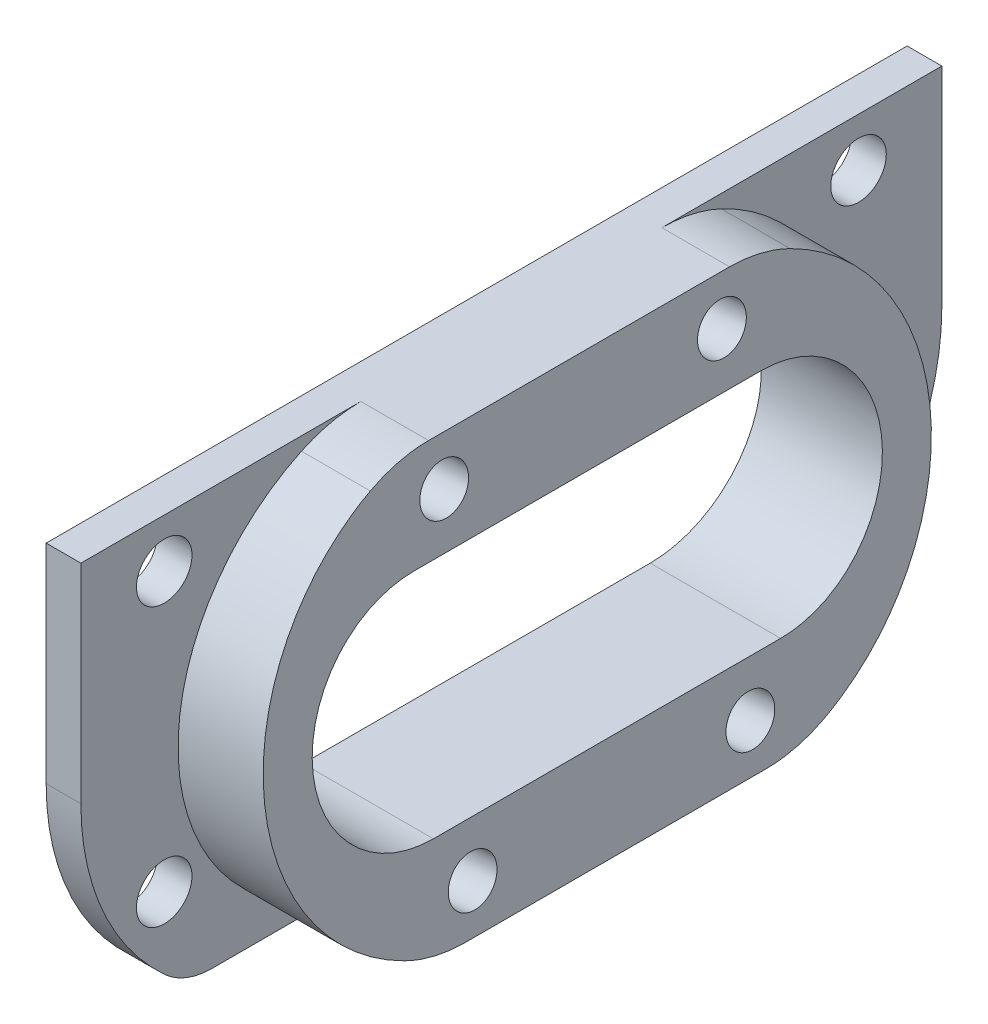
ISO-10303-21;
HEADER;
FILE_DESCRIPTION(('STEP AP214'),'2;1');
FILE_NAME('part.step','',(''),(''),'','','');
FILE_SCHEMA(('AUTOMOTIVE_DESIGN { 1 0 10303 214 1 1 1 1 }'));
ENDSEC;
DATA;
#1=APPLICATION_CONTEXT('core data for automotive mechanical design processes');
#2=APPLICATION_PROTOCOL_DEFINITION('international standard','automotive_design',2000,#1);
#3=PRODUCT_CONTEXT('',#1,'mechanical');
#4=PRODUCT('Part','Part','',(#3));
#5=PRODUCT_RELATED_PRODUCT_CATEGORY('part','',(#4));
#6=PRODUCT_DEFINITION_FORMATION('','',#4);
#7=PRODUCT_DEFINITION_CONTEXT('part definition',#1,'design');
#8=PRODUCT_DEFINITION('design','',#6,#7);
#9=PRODUCT_DEFINITION_SHAPE('','',#8);
#10=(LENGTH_UNIT() NAMED_UNIT(*) SI_UNIT(.MILLI.,.METRE.));
#11=(NAMED_UNIT(*) PLANE_ANGLE_UNIT() SI_UNIT($,.RADIAN.));
#12=(NAMED_UNIT(*) SI_UNIT($,.STERADIAN.) SOLID_ANGLE_UNIT());
#13=UNCERTAINTY_MEASURE_WITH_UNIT(LENGTH_MEASURE(1.E-05),#10,'distance_accuracy_value','');
#14=(GEOMETRIC_REPRESENTATION_CONTEXT(3) GLOBAL_UNCERTAINTY_ASSIGNED_CONTEXT((#13)) GLOBAL_UNIT_ASSIGNED_CONTEXT((#10,
#11,#12)) REPRESENTATION_CONTEXT('',''));
#15=CARTESIAN_POINT('',(0.,0.,0.));
#16=DIRECTION('',(0.,0.,1.));
#17=DIRECTION('',(1.,0.,0.));
#18=AXIS2_PLACEMENT_3D('',#15,#16,#17);
#19=CARTESIAN_POINT('',(20.,0.,-25.));
#20=DIRECTION('',(-1.,0.,0.));
#21=DIRECTION('',(0.,0.,1.));
#22=AXIS2_PLACEMENT_3D('',#19,#20,#21);
#23=CYLINDRICAL_SURFACE('',#22,37.);
#24=CARTESIAN_POINT('',(5.,0.,-25.));
#25=DIRECTION('',(1.,0.,0.));
#26=DIRECTION('',(0.,0.,-1.));
#27=AXIS2_PLACEMENT_3D('',#24,#25,#26);
#28=CIRCLE('',#27,37.);
#29=CARTESIAN_POINT('',(5.,-27.4074074074074,-49.8562672017419));
#30=VERTEX_POINT('',#29);
#31=CARTESIAN_POINT('',(5.,0.,-62.));
#32=VERTEX_POINT('',#31);
#33=EDGE_CURVE('E293',#30,#32,#28,.T.);
#34=ORIENTED_EDGE('',*,*,#33,.F.);
#35=DIRECTION('',(-1.,0.,0.));
#36=VECTOR('',#35,1.);
#37=CARTESIAN_POINT('',(20.,-27.4074074074074,-49.8562672017419));
#38=LINE('',#37,#36);
#39=CARTESIAN_POINT('',(0.,-27.4074074074074,-49.8562672017419));
#40=VERTEX_POINT('',#39);
#41=EDGE_CURVE('E342',#30,#40,#38,.T.);
#42=ORIENTED_EDGE('',*,*,#41,.T.);
#43=CARTESIAN_POINT('',(0.,0.,-25.));
#44=DIRECTION('',(1.,0.,0.));
#45=DIRECTION('',(0.,0.,-1.));
#46=AXIS2_PLACEMENT_3D('',#43,#44,#45);
#47=CIRCLE('',#46,37.);
#48=CARTESIAN_POINT('',(0.,0.,-62.));
#49=VERTEX_POINT('',#48);
#50=EDGE_CURVE('E339',#40,#49,#47,.T.);
#51=ORIENTED_EDGE('',*,*,#50,.T.);
#52=DIRECTION('',(-1.,0.,0.));
#53=VECTOR('',#52,1.);
#54=CARTESIAN_POINT('',(20.,0.,-62.));
#55=LINE('',#54,#53);
#56=EDGE_CURVE('E48',#32,#49,#55,.T.);
#57=ORIENTED_EDGE('',*,*,#56,.F.);
#58=EDGE_LOOP('',(#34,#42,#51,#57));
#59=FACE_BOUND('',#58,.T.);
#60=ADVANCED_FACE('F41',(#59),#23,.T.);
#61=CARTESIAN_POINT('',(20.,0.,-62.));
#62=DIRECTION('',(0.,0.,1.));
#63=DIRECTION('',(0.,-1.,0.));
#64=AXIS2_PLACEMENT_3D('',#61,#62,#63);
#65=PLANE('',#64);
#66=DIRECTION('',(0.,1.,0.));
#67=VECTOR('',#66,1.);
#68=CARTESIAN_POINT('',(5.,0.,-62.));
#69=LINE('',#68,#67);
#70=CARTESIAN_POINT('',(5.,30.,-62.));
#71=VERTEX_POINT('',#70);
#72=EDGE_CURVE('E296',#32,#71,#69,.T.);
#73=ORIENTED_EDGE('',*,*,#72,.F.);
#74=ORIENTED_EDGE('',*,*,#56,.T.);
#75=DIRECTION('',(0.,1.,0.));
#76=VECTOR('',#75,1.);
#77=CARTESIAN_POINT('',(0.,0.,-62.));
#78=LINE('',#77,#76);
#79=CARTESIAN_POINT('',(0.,30.,-62.));
#80=VERTEX_POINT('',#79);
#81=EDGE_CURVE('E346',#49,#80,#78,.T.);
#82=ORIENTED_EDGE('',*,*,#81,.T.);
#83=DIRECTION('',(-1.,0.,0.));
#84=VECTOR('',#83,1.);
#85=CARTESIAN_POINT('',(20.,30.,-62.));
#86=LINE('',#85,#84);
#87=EDGE_CURVE('E377',#71,#80,#86,.T.);
#88=ORIENTED_EDGE('',*,*,#87,.F.);
#89=EDGE_LOOP('',(#73,#74,#82,#88));
#90=FACE_BOUND('',#89,.T.);
#91=ADVANCED_FACE('F461',(#90),#65,.F.);
#92=CARTESIAN_POINT('',(20.,30.,62.));
#93=DIRECTION('',(0.,0.,-1.));
#94=DIRECTION('',(0.,1.,0.));
#95=AXIS2_PLACEMENT_3D('',#92,#93,#94);
#96=PLANE('',#95);
#97=DIRECTION('',(0.,-1.,0.));
#98=VECTOR('',#97,1.);
#99=CARTESIAN_POINT('',(5.,30.,62.));
#100=LINE('',#99,#98);
#101=CARTESIAN_POINT('',(5.,30.,62.));
#102=VERTEX_POINT('',#101);
#103=CARTESIAN_POINT('',(5.,0.,62.));
#104=VERTEX_POINT('',#103);
#105=EDGE_CURVE('E305',#102,#104,#100,.T.);
#106=ORIENTED_EDGE('',*,*,#105,.F.);
#107=DIRECTION('',(-1.,0.,0.));
#108=VECTOR('',#107,1.);
#109=CARTESIAN_POINT('',(20.,30.,62.));
#110=LINE('',#109,#108);
#111=CARTESIAN_POINT('',(0.,30.,62.));
#112=VERTEX_POINT('',#111);
#113=EDGE_CURVE('E375',#102,#112,#110,.T.);
#114=ORIENTED_EDGE('',*,*,#113,.T.);
#115=DIRECTION('',(0.,-1.,0.));
#116=VECTOR('',#115,1.);
#117=CARTESIAN_POINT('',(0.,30.,62.));
#118=LINE('',#117,#116);
#119=CARTESIAN_POINT('',(0.,0.,62.));
#120=VERTEX_POINT('',#119);
#121=EDGE_CURVE('E352',#112,#120,#118,.T.);
#122=ORIENTED_EDGE('',*,*,#121,.T.);
#123=DIRECTION('',(-1.,0.,0.));
#124=VECTOR('',#123,1.);
#125=CARTESIAN_POINT('',(20.,0.,62.));
#126=LINE('',#125,#124);
#127=EDGE_CURVE('E373',#104,#120,#126,.T.);
#128=ORIENTED_EDGE('',*,*,#127,.F.);
#129=EDGE_LOOP('',(#106,#114,#122,#128));
#130=FACE_BOUND('',#129,.T.);
#131=ADVANCED_FACE('F402',(#130),#96,.F.);
#132=CARTESIAN_POINT('',(20.,0.,25.));
#133=DIRECTION('',(-1.,0.,0.));
#134=DIRECTION('',(0.,0.,1.));
#135=AXIS2_PLACEMENT_3D('',#132,#133,#134);
#136=CYLINDRICAL_SURFACE('',#135,37.);
#137=CARTESIAN_POINT('',(5.,0.,25.));
#138=DIRECTION('',(1.,0.,0.));
#139=DIRECTION('',(0.,0.,-1.));
#140=AXIS2_PLACEMENT_3D('',#137,#138,#139);
#141=CIRCLE('',#140,37.);
#142=CARTESIAN_POINT('',(5.,-27.4074074074074,49.8562672017419));
#143=VERTEX_POINT('',#142);
#144=EDGE_CURVE('E303',#104,#143,#141,.T.);
#145=ORIENTED_EDGE('',*,*,#144,.F.);
#146=ORIENTED_EDGE('',*,*,#127,.T.);
#147=CARTESIAN_POINT('',(0.,0.,25.));
#148=DIRECTION('',(1.,0.,0.));
#149=DIRECTION('',(0.,0.,-1.));
#150=AXIS2_PLACEMENT_3D('',#147,#148,#149);
#151=CIRCLE('',#150,37.);
#152=CARTESIAN_POINT('',(0.,-27.4074074074074,49.8562672017419));
#153=VERTEX_POINT('',#152);
#154=EDGE_CURVE('E355',#120,#153,#151,.T.);
#155=ORIENTED_EDGE('',*,*,#154,.T.);
#156=DIRECTION('',(-1.,0.,0.));
#157=VECTOR('',#156,1.);
#158=CARTESIAN_POINT('',(20.,-27.4074074074074,49.8562672017419));
#159=LINE('',#158,#157);
#160=EDGE_CURVE('E371',#143,#153,#159,.T.);
#161=ORIENTED_EDGE('',*,*,#160,.F.);
#162=EDGE_LOOP('',(#145,#146,#155,#161));
#163=FACE_BOUND('',#162,.T.);
#164=ADVANCED_FACE('F418',(#163),#136,.T.);
#165=CARTESIAN_POINT('',(20.,-20.,43.138357147217));
#166=DIRECTION('',(-1.,0.,0.));
#167=DIRECTION('',(0.,0.,1.));
#168=AXIS2_PLACEMENT_3D('',#165,#166,#167);
#169=CYLINDRICAL_SURFACE('',#168,10.);
#170=CARTESIAN_POINT('',(5.,-20.,43.138357147217));
#171=DIRECTION('',(1.,0.,0.));
#172=DIRECTION('',(0.,0.,-1.));
#173=AXIS2_PLACEMENT_3D('',#170,#171,#172);
#174=CIRCLE('',#173,10.);
#175=CARTESIAN_POINT('',(5.,-30.,43.138357147217));
#176=VERTEX_POINT('',#175);
#177=EDGE_CURVE('E301',#143,#176,#174,.T.);
#178=ORIENTED_EDGE('',*,*,#177,.F.);
#179=ORIENTED_EDGE('',*,*,#160,.T.);
#180=CARTESIAN_POINT('',(0.,-20.,43.138357147217));
#181=DIRECTION('',(1.,0.,0.));
#182=DIRECTION('',(0.,0.,-1.));
#183=AXIS2_PLACEMENT_3D('',#180,#181,#182);
#184=CIRCLE('',#183,10.);
#185=CARTESIAN_POINT('',(0.,-30.,43.138357147217));
#186=VERTEX_POINT('',#185);
#187=EDGE_CURVE('E358',#153,#186,#184,.T.);
#188=ORIENTED_EDGE('',*,*,#187,.T.);
#189=DIRECTION('',(-1.,0.,0.));
#190=VECTOR('',#189,1.);
#191=CARTESIAN_POINT('',(20.,-30.,43.138357147217));
#192=LINE('',#191,#190);
#193=EDGE_CURVE('E369',#176,#186,#192,.T.);
#194=ORIENTED_EDGE('',*,*,#193,.F.);
#195=EDGE_LOOP('',(#178,#179,#188,#194));
#196=FACE_BOUND('',#195,.T.);
#197=ADVANCED_FACE('F423',(#196),#169,.T.);
#198=CARTESIAN_POINT('',(20.,-30.,43.138357147217));
#199=DIRECTION('',(0.,1.,0.));
#200=DIRECTION('',(0.,0.,1.));
#201=AXIS2_PLACEMENT_3D('',#198,#199,#200);
#202=PLANE('',#201);
#203=DIRECTION('',(1.,0.,0.));
#204=VECTOR('',#203,1.);
#205=CARTESIAN_POINT('',(5.,-30.,21.6717685614745));
#206=LINE('',#205,#204);
#207=CARTESIAN_POINT('',(5.,-30.,21.6717685614745));
#208=VERTEX_POINT('',#207);
#209=CARTESIAN_POINT('',(20.,-30.,21.6717685614745));
#210=VERTEX_POINT('',#209);
#211=EDGE_CURVE('E256',#208,#210,#206,.T.);
#212=ORIENTED_EDGE('',*,*,#211,.F.);
#213=DIRECTION('',(0.,0.,-1.));
#214=VECTOR('',#213,1.);
#215=CARTESIAN_POINT('',(5.,-30.,43.138357147217));
#216=LINE('',#215,#214);
#217=EDGE_CURVE('E294',#176,#208,#216,.T.);
#218=ORIENTED_EDGE('',*,*,#217,.F.);
#219=ORIENTED_EDGE('',*,*,#193,.T.);
#220=DIRECTION('',(0.,0.,-1.));
#221=VECTOR('',#220,1.);
#222=CARTESIAN_POINT('',(0.,-30.,43.138357147217));
#223=LINE('',#222,#221);
#224=CARTESIAN_POINT('',(0.,-30.,-43.1383571472171));
#225=VERTEX_POINT('',#224);
#226=EDGE_CURVE('E361',#186,#225,#223,.T.);
#227=ORIENTED_EDGE('',*,*,#226,.T.);
#228=DIRECTION('',(-1.,0.,0.));
#229=VECTOR('',#228,1.);
#230=CARTESIAN_POINT('',(20.,-30.,-43.1383571472171));
#231=LINE('',#230,#229);
#232=CARTESIAN_POINT('',(5.,-30.,-43.1383571472171));
#233=VERTEX_POINT('',#232);
#234=EDGE_CURVE('E367',#233,#225,#231,.T.);
#235=ORIENTED_EDGE('',*,*,#234,.F.);
#236=CARTESIAN_POINT('',(5.,-30.,-21.6717685614745));
#237=VERTEX_POINT('',#236);
#238=EDGE_CURVE('E291',#237,#233,#216,.T.);
#239=ORIENTED_EDGE('',*,*,#238,.F.);
#240=DIRECTION('',(1.,0.,0.));
#241=VECTOR('',#240,1.);
#242=CARTESIAN_POINT('',(5.,-30.,-21.6717685614745));
#243=LINE('',#242,#241);
#244=CARTESIAN_POINT('',(20.,-30.,-21.6717685614745));
#245=VERTEX_POINT('',#244);
#246=EDGE_CURVE('E276',#237,#245,#243,.T.);
#247=ORIENTED_EDGE('',*,*,#246,.T.);
#248=DIRECTION('',(0.,0.,-1.));
#249=VECTOR('',#248,1.);
#250=CARTESIAN_POINT('',(20.,-30.,43.138357147217));
#251=LINE('',#250,#249);
#252=EDGE_CURVE('E340',#210,#245,#251,.T.);
#253=ORIENTED_EDGE('',*,*,#252,.F.);
#254=EDGE_LOOP('',(#212,#218,#219,#227,#235,#239,#247,#253));
#255=FACE_BOUND('',#254,.T.);
#256=ADVANCED_FACE('F426',(#255),#202,.F.);
#257=CARTESIAN_POINT('',(20.,-20.,-43.1383571472171));
#258=DIRECTION('',(-1.,0.,0.));
#259=DIRECTION('',(0.,0.,1.));
#260=AXIS2_PLACEMENT_3D('',#257,#258,#259);
#261=CYLINDRICAL_SURFACE('',#260,9.99999999999999);
#262=CARTESIAN_POINT('',(5.,-20.,-43.1383571472171));
#263=DIRECTION('',(1.,0.,0.));
#264=DIRECTION('',(0.,0.,-1.));
#265=AXIS2_PLACEMENT_3D('',#262,#263,#264);
#266=CIRCLE('',#265,9.99999999999999);
#267=EDGE_CURVE('E289',#233,#30,#266,.T.);
#268=ORIENTED_EDGE('',*,*,#267,.F.);
#269=ORIENTED_EDGE('',*,*,#234,.T.);
#270=CARTESIAN_POINT('',(0.,-20.,-43.1383571472171));
#271=DIRECTION('',(1.,0.,0.));
#272=DIRECTION('',(0.,0.,-1.));
#273=AXIS2_PLACEMENT_3D('',#270,#271,#272);
#274=CIRCLE('',#273,9.99999999999999);
#275=EDGE_CURVE('E343',#225,#40,#274,.T.);
#276=ORIENTED_EDGE('',*,*,#275,.T.);
#277=ORIENTED_EDGE('',*,*,#41,.F.);
#278=EDGE_LOOP('',(#268,#269,#276,#277));
#279=FACE_BOUND('',#278,.T.);
#280=ADVANCED_FACE('F456',(#279),#261,.T.);
#281=CARTESIAN_POINT('',(20.,23.,50.));
#282=DIRECTION('',(-1.,0.,0.));
#283=DIRECTION('',(0.,0.,1.));
#284=AXIS2_PLACEMENT_3D('',#281,#282,#283);
#285=CYLINDRICAL_SURFACE('',#284,4.00000000000001);
#286=CARTESIAN_POINT('',(0.,23.,50.));
#287=DIRECTION('',(1.,0.,0.));
#288=DIRECTION('',(0.,0.,-1.));
#289=AXIS2_PLACEMENT_3D('',#286,#287,#288);
#290=CIRCLE('',#289,4.00000000000001);
#291=CARTESIAN_POINT('',(0.,23.,46.));
#292=VERTEX_POINT('',#291);
#293=EDGE_CURVE('E316',#292,#292,#290,.T.);
#294=ORIENTED_EDGE('',*,*,#293,.F.);
#295=EDGE_LOOP('',(#294));
#296=FACE_BOUND('',#295,.T.);
#297=CARTESIAN_POINT('',(5.,23.,50.));
#298=DIRECTION('',(1.,0.,0.));
#299=DIRECTION('',(0.,0.,-1.));
#300=AXIS2_PLACEMENT_3D('',#297,#298,#299);
#301=CIRCLE('',#300,4.00000000000001);
#302=CARTESIAN_POINT('',(5.,23.,46.));
#303=VERTEX_POINT('',#302);
#304=EDGE_CURVE('E286',#303,#303,#301,.T.);
#305=ORIENTED_EDGE('',*,*,#304,.T.);
#306=EDGE_LOOP('',(#305));
#307=FACE_BOUND('',#306,.T.);
#308=ADVANCED_FACE('F480',(#296,#307),#285,.F.);
#309=CARTESIAN_POINT('',(20.,23.,-50.));
#310=DIRECTION('',(-1.,0.,0.));
#311=DIRECTION('',(0.,0.,1.));
#312=AXIS2_PLACEMENT_3D('',#309,#310,#311);
#313=CYLINDRICAL_SURFACE('',#312,4.00000000000001);
#314=CARTESIAN_POINT('',(0.,23.,-50.));
#315=DIRECTION('',(1.,0.,0.));
#316=DIRECTION('',(0.,0.,-1.));
#317=AXIS2_PLACEMENT_3D('',#314,#315,#316);
#318=CIRCLE('',#317,4.00000000000001);
#319=CARTESIAN_POINT('',(0.,23.,-54.));
#320=VERTEX_POINT('',#319);
#321=EDGE_CURVE('E313',#320,#320,#318,.T.);
#322=ORIENTED_EDGE('',*,*,#321,.F.);
#323=EDGE_LOOP('',(#322));
#324=FACE_BOUND('',#323,.T.);
#325=CARTESIAN_POINT('',(5.,23.,-50.));
#326=DIRECTION('',(1.,0.,0.));
#327=DIRECTION('',(0.,0.,-1.));
#328=AXIS2_PLACEMENT_3D('',#325,#326,#327);
#329=CIRCLE('',#328,4.00000000000001);
#330=CARTESIAN_POINT('',(5.,23.,-54.));
#331=VERTEX_POINT('',#330);
#332=EDGE_CURVE('E283',#331,#331,#329,.T.);
#333=ORIENTED_EDGE('',*,*,#332,.T.);
#334=EDGE_LOOP('',(#333));
#335=FACE_BOUND('',#334,.T.);
#336=ADVANCED_FACE('F499',(#324,#335),#313,.F.);
#337=CARTESIAN_POINT('',(20.,-17.,-50.0000000000004));
#338=DIRECTION('',(-1.,0.,0.));
#339=DIRECTION('',(0.,0.,1.));
#340=AXIS2_PLACEMENT_3D('',#337,#338,#339);
#341=CYLINDRICAL_SURFACE('',#340,4.00000000000001);
#342=CARTESIAN_POINT('',(0.,-17.,-50.0000000000004));
#343=DIRECTION('',(1.,0.,0.));
#344=DIRECTION('',(0.,0.,-1.));
#345=AXIS2_PLACEMENT_3D('',#342,#343,#344);
#346=CIRCLE('',#345,4.00000000000001);
#347=CARTESIAN_POINT('',(0.,-17.,-54.0000000000004));
#348=VERTEX_POINT('',#347);
#349=EDGE_CURVE('E310',#348,#348,#346,.T.);
#350=ORIENTED_EDGE('',*,*,#349,.F.);
#351=EDGE_LOOP('',(#350));
#352=FACE_BOUND('',#351,.T.);
#353=CARTESIAN_POINT('',(5.,-17.,-50.0000000000004));
#354=DIRECTION('',(1.,0.,0.));
#355=DIRECTION('',(0.,0.,-1.));
#356=AXIS2_PLACEMENT_3D('',#353,#354,#355);
#357=CIRCLE('',#356,4.00000000000001);
#358=CARTESIAN_POINT('',(5.,-17.,-54.0000000000004));
#359=VERTEX_POINT('',#358);
#360=EDGE_CURVE('E280',#359,#359,#357,.T.);
#361=ORIENTED_EDGE('',*,*,#360,.T.);
#362=EDGE_LOOP('',(#361));
#363=FACE_BOUND('',#362,.T.);
#364=ADVANCED_FACE('F503',(#352,#363),#341,.F.);
#365=CARTESIAN_POINT('',(20.,-17.,49.9999999999996));
#366=DIRECTION('',(-1.,0.,0.));
#367=DIRECTION('',(0.,0.,1.));
#368=AXIS2_PLACEMENT_3D('',#365,#366,#367);
#369=CYLINDRICAL_SURFACE('',#368,4.00000000000001);
#370=CARTESIAN_POINT('',(0.,-17.,49.9999999999996));
#371=DIRECTION('',(1.,0.,0.));
#372=DIRECTION('',(0.,0.,-1.));
#373=AXIS2_PLACEMENT_3D('',#370,#371,#372);
#374=CIRCLE('',#373,4.00000000000001);
#375=CARTESIAN_POINT('',(0.,-17.,45.9999999999996));
#376=VERTEX_POINT('',#375);
#377=EDGE_CURVE('E307',#376,#376,#374,.T.);
#378=ORIENTED_EDGE('',*,*,#377,.F.);
#379=EDGE_LOOP('',(#378));
#380=FACE_BOUND('',#379,.T.);
#381=CARTESIAN_POINT('',(5.,-17.,49.9999999999996));
#382=DIRECTION('',(1.,0.,0.));
#383=DIRECTION('',(0.,0.,-1.));
#384=AXIS2_PLACEMENT_3D('',#381,#382,#383);
#385=CIRCLE('',#384,4.00000000000001);
#386=CARTESIAN_POINT('',(5.,-17.,45.9999999999996));
#387=VERTEX_POINT('',#386);
#388=EDGE_CURVE('E260',#387,#387,#385,.T.);
#389=ORIENTED_EDGE('',*,*,#388,.T.);
#390=EDGE_LOOP('',(#389));
#391=FACE_BOUND('',#390,.T.);
#392=ADVANCED_FACE('F382',(#380,#391),#369,.F.);
#393=CARTESIAN_POINT('',(0.,0.,-25.));
#394=DIRECTION('',(1.,0.,0.));
#395=DIRECTION('',(0.,0.,-1.));
#396=AXIS2_PLACEMENT_3D('',#393,#394,#395);
#397=PLANE('',#396);
#398=ORIENTED_EDGE('',*,*,#50,.F.);
#399=ORIENTED_EDGE('',*,*,#275,.F.);
#400=ORIENTED_EDGE('',*,*,#226,.F.);
#401=ORIENTED_EDGE('',*,*,#187,.F.);
#402=ORIENTED_EDGE('',*,*,#154,.F.);
#403=ORIENTED_EDGE('',*,*,#121,.F.);
#404=DIRECTION('',(0.,0.,1.));
#405=VECTOR('',#404,1.);
#406=CARTESIAN_POINT('',(0.,30.,62.));
#407=LINE('',#406,#405);
#408=EDGE_CURVE('E349',#80,#112,#407,.T.);
#409=ORIENTED_EDGE('',*,*,#408,.F.);
#410=ORIENTED_EDGE('',*,*,#81,.F.);
#411=EDGE_LOOP('',(#398,#399,#400,#401,#402,#403,#409,#410));
#412=FACE_BOUND('',#411,.T.);
#413=CARTESIAN_POINT('',(0.,0.,25.));
#414=DIRECTION('',(1.,0.,0.));
#415=DIRECTION('',(0.,0.,-1.));
#416=AXIS2_PLACEMENT_3D('',#413,#414,#415);
#417=CIRCLE('',#416,16.);
#418=CARTESIAN_POINT('',(0.,16.,25.));
#419=VERTEX_POINT('',#418);
#420=CARTESIAN_POINT('',(0.,-16.,25.));
#421=VERTEX_POINT('',#420);
#422=EDGE_CURVE('E319',#419,#421,#417,.T.);
#423=ORIENTED_EDGE('',*,*,#422,.T.);
#424=DIRECTION('',(0.,0.,-1.));
#425=VECTOR('',#424,1.);
#426=CARTESIAN_POINT('',(0.,-16.,25.));
#427=LINE('',#426,#425);
#428=CARTESIAN_POINT('',(0.,-16.,-25.));
#429=VERTEX_POINT('',#428);
#430=EDGE_CURVE('E322',#421,#429,#427,.T.);
#431=ORIENTED_EDGE('',*,*,#430,.T.);
#432=CARTESIAN_POINT('',(0.,0.,-25.));
#433=DIRECTION('',(1.,0.,0.));
#434=DIRECTION('',(0.,0.,-1.));
#435=AXIS2_PLACEMENT_3D('',#432,#433,#434);
#436=CIRCLE('',#435,16.);
#437=CARTESIAN_POINT('',(0.,16.,-25.));
#438=VERTEX_POINT('',#437);
#439=EDGE_CURVE('E325',#429,#438,#436,.T.);
#440=ORIENTED_EDGE('',*,*,#439,.T.);
#441=DIRECTION('',(0.,0.,1.));
#442=VECTOR('',#441,1.);
#443=CARTESIAN_POINT('',(0.,16.,-25.));
#444=LINE('',#443,#442);
#445=EDGE_CURVE('E328',#438,#419,#444,.T.);
#446=ORIENTED_EDGE('',*,*,#445,.T.);
#447=EDGE_LOOP('',(#423,#431,#440,#446));
#448=FACE_BOUND('',#447,.T.);
#449=ORIENTED_EDGE('',*,*,#293,.T.);
#450=EDGE_LOOP('',(#449));
#451=FACE_BOUND('',#450,.T.);
#452=ORIENTED_EDGE('',*,*,#321,.T.);
#453=EDGE_LOOP('',(#452));
#454=FACE_BOUND('',#453,.T.);
#455=ORIENTED_EDGE('',*,*,#349,.T.);
#456=EDGE_LOOP('',(#455));
#457=FACE_BOUND('',#456,.T.);
#458=ORIENTED_EDGE('',*,*,#377,.T.);
#459=EDGE_LOOP('',(#458));
#460=FACE_BOUND('',#459,.T.);
#461=ADVANCED_FACE('F412',(#412,#448,#451,#454,#457,#460),#397,.F.);
#462=CARTESIAN_POINT('',(20.,30.,62.));
#463=DIRECTION('',(0.,-1.,0.));
#464=DIRECTION('',(0.,0.,-1.));
#465=AXIS2_PLACEMENT_3D('',#462,#463,#464);
#466=PLANE('',#465);
#467=DIRECTION('',(1.,0.,0.));
#468=VECTOR('',#467,1.);
#469=CARTESIAN_POINT('',(5.,30.,21.6717685614745));
#470=LINE('',#469,#468);
#471=CARTESIAN_POINT('',(5.,30.,21.6717685614745));
#472=VERTEX_POINT('',#471);
#473=CARTESIAN_POINT('',(14.7506801884445,30.,21.6717685614745));
#474=VERTEX_POINT('',#473);
#475=EDGE_CURVE('E264',#472,#474,#470,.T.);
#476=ORIENTED_EDGE('',*,*,#475,.T.);
#477=DIRECTION('',(0.,0.,-1.));
#478=VECTOR('',#477,1.);
#479=CARTESIAN_POINT('',(14.7506801884445,30.,62.));
#480=LINE('',#479,#478);
#481=CARTESIAN_POINT('',(14.7506801884445,30.,-21.6717685614745));
#482=VERTEX_POINT('',#481);
#483=EDGE_CURVE('E220',#474,#482,#480,.T.);
#484=ORIENTED_EDGE('',*,*,#483,.T.);
#485=DIRECTION('',(1.,0.,0.));
#486=VECTOR('',#485,1.);
#487=CARTESIAN_POINT('',(5.,30.,-21.6717685614745));
#488=LINE('',#487,#486);
#489=CARTESIAN_POINT('',(5.,30.,-21.6717685614745));
#490=VERTEX_POINT('',#489);
#491=EDGE_CURVE('E267',#490,#482,#488,.T.);
#492=ORIENTED_EDGE('',*,*,#491,.F.);
#493=DIRECTION('',(0.,0.,1.));
#494=VECTOR('',#493,1.);
#495=CARTESIAN_POINT('',(5.,30.,62.));
#496=LINE('',#495,#494);
#497=EDGE_CURVE('E298',#71,#490,#496,.T.);
#498=ORIENTED_EDGE('',*,*,#497,.F.);
#499=ORIENTED_EDGE('',*,*,#87,.T.);
#500=ORIENTED_EDGE('',*,*,#408,.T.);
#501=ORIENTED_EDGE('',*,*,#113,.F.);
#502=EDGE_CURVE('E300',#472,#102,#496,.T.);
#503=ORIENTED_EDGE('',*,*,#502,.F.);
#504=EDGE_LOOP('',(#476,#484,#492,#498,#499,#500,#501,#503));
#505=FACE_BOUND('',#504,.T.);
#506=ADVANCED_FACE('F403',(#505),#466,.F.);
#507=CARTESIAN_POINT('',(20.,0.,25.));
#508=DIRECTION('',(-1.,0.,0.));
#509=DIRECTION('',(0.,0.,1.));
#510=AXIS2_PLACEMENT_3D('',#507,#508,#509);
#511=CYLINDRICAL_SURFACE('',#510,16.);
#512=CARTESIAN_POINT('',(17.3753400942223,0.,25.));
#513=DIRECTION('',(-0.996194698091746,-0.0871557427476583,0.));
#514=DIRECTION('',(-0.0871557427476583,0.996194698091746,0.));
#515=AXIS2_PLACEMENT_3D('',#512,#513,#514);
#516=ELLIPSE('',#515,16.0611174006936,16.);
#517=CARTESIAN_POINT('',(18.7751587106371,-16.,25.));
#518=VERTEX_POINT('',#517);
#519=CARTESIAN_POINT('',(15.9755214778075,16.,25.));
#520=VERTEX_POINT('',#519);
#521=EDGE_CURVE('E55',#518,#520,#516,.T.);
#522=ORIENTED_EDGE('',*,*,#521,.F.);
#523=DIRECTION('',(-1.,0.,0.));
#524=VECTOR('',#523,1.);
#525=CARTESIAN_POINT('',(20.,-16.,25.));
#526=LINE('',#525,#524);
#527=EDGE_CURVE('E337',#518,#421,#526,.T.);
#528=ORIENTED_EDGE('',*,*,#527,.T.);
#529=ORIENTED_EDGE('',*,*,#422,.F.);
#530=DIRECTION('',(-1.,0.,0.));
#531=VECTOR('',#530,1.);
#532=CARTESIAN_POINT('',(20.,16.,25.));
#533=LINE('',#532,#531);
#534=EDGE_CURVE('E331',#520,#419,#533,.T.);
#535=ORIENTED_EDGE('',*,*,#534,.F.);
#536=EDGE_LOOP('',(#522,#528,#529,#535));
#537=FACE_BOUND('',#536,.T.);
#538=ADVANCED_FACE('F470',(#537),#511,.F.);
#539=CARTESIAN_POINT('',(20.,-16.,25.));
#540=DIRECTION('',(0.,1.,0.));
#541=DIRECTION('',(0.,0.,1.));
#542=AXIS2_PLACEMENT_3D('',#539,#540,#541);
#543=PLANE('',#542);
#544=DIRECTION('',(0.,0.,1.));
#545=VECTOR('',#544,1.);
#546=CARTESIAN_POINT('',(18.7751587106371,-16.,25.));
#547=LINE('',#546,#545);
#548=CARTESIAN_POINT('',(18.7751587106371,-16.,-25.));
#549=VERTEX_POINT('',#548);
#550=EDGE_CURVE('E237',#549,#518,#547,.T.);
#551=ORIENTED_EDGE('',*,*,#550,.F.);
#552=DIRECTION('',(-1.,0.,0.));
#553=VECTOR('',#552,1.);
#554=CARTESIAN_POINT('',(20.,-16.,-25.));
#555=LINE('',#554,#553);
#556=EDGE_CURVE('E335',#549,#429,#555,.T.);
#557=ORIENTED_EDGE('',*,*,#556,.T.);
#558=ORIENTED_EDGE('',*,*,#430,.F.);
#559=ORIENTED_EDGE('',*,*,#527,.F.);
#560=EDGE_LOOP('',(#551,#557,#558,#559));
#561=FACE_BOUND('',#560,.T.);
#562=ADVANCED_FACE('F485',(#561),#543,.T.);
#563=CARTESIAN_POINT('',(20.,0.,-25.));
#564=DIRECTION('',(-1.,0.,0.));
#565=DIRECTION('',(0.,0.,1.));
#566=AXIS2_PLACEMENT_3D('',#563,#564,#565);
#567=CYLINDRICAL_SURFACE('',#566,16.);
#568=CARTESIAN_POINT('',(17.3753400942223,0.,-25.));
#569=DIRECTION('',(-0.996194698091746,-0.0871557427476583,0.));
#570=DIRECTION('',(-0.0871557427476583,0.996194698091746,0.));
#571=AXIS2_PLACEMENT_3D('',#568,#569,#570);
#572=ELLIPSE('',#571,16.0611174006936,16.);
#573=CARTESIAN_POINT('',(15.9755214778075,16.,-25.));
#574=VERTEX_POINT('',#573);
#575=EDGE_CURVE('E235',#574,#549,#572,.T.);
#576=ORIENTED_EDGE('',*,*,#575,.F.);
#577=DIRECTION('',(-1.,0.,0.));
#578=VECTOR('',#577,1.);
#579=CARTESIAN_POINT('',(20.,16.,-25.));
#580=LINE('',#579,#578);
#581=EDGE_CURVE('E333',#574,#438,#580,.T.);
#582=ORIENTED_EDGE('',*,*,#581,.T.);
#583=ORIENTED_EDGE('',*,*,#439,.F.);
#584=ORIENTED_EDGE('',*,*,#556,.F.);
#585=EDGE_LOOP('',(#576,#582,#583,#584));
#586=FACE_BOUND('',#585,.T.);
#587=ADVANCED_FACE('F489',(#586),#567,.F.);
#588=CARTESIAN_POINT('',(20.,16.,-25.));
#589=DIRECTION('',(0.,-1.,0.));
#590=DIRECTION('',(0.,0.,-1.));
#591=AXIS2_PLACEMENT_3D('',#588,#589,#590);
#592=PLANE('',#591);
#593=DIRECTION('',(0.,0.,-1.));
#594=VECTOR('',#593,1.);
#595=CARTESIAN_POINT('',(15.9755214778075,16.,-25.));
#596=LINE('',#595,#594);
#597=EDGE_CURVE('E233',#520,#574,#596,.T.);
#598=ORIENTED_EDGE('',*,*,#597,.F.);
#599=ORIENTED_EDGE('',*,*,#534,.T.);
#600=ORIENTED_EDGE('',*,*,#445,.F.);
#601=ORIENTED_EDGE('',*,*,#581,.F.);
#602=EDGE_LOOP('',(#598,#599,#600,#601));
#603=FACE_BOUND('',#602,.T.);
#604=ADVANCED_FACE('F388',(#603),#592,.T.);
#605=CARTESIAN_POINT('',(5.,0.,0.));
#606=DIRECTION('',(1.,0.,0.));
#607=DIRECTION('',(0.,0.,-1.));
#608=AXIS2_PLACEMENT_3D('',#605,#606,#607);
#609=PLANE('',#608);
#610=ORIENTED_EDGE('',*,*,#388,.F.);
#611=EDGE_LOOP('',(#610));
#612=FACE_BOUND('',#611,.T.);
#613=ORIENTED_EDGE('',*,*,#304,.F.);
#614=EDGE_LOOP('',(#613));
#615=FACE_BOUND('',#614,.T.);
#616=ORIENTED_EDGE('',*,*,#502,.T.);
#617=ORIENTED_EDGE('',*,*,#105,.T.);
#618=ORIENTED_EDGE('',*,*,#144,.T.);
#619=ORIENTED_EDGE('',*,*,#177,.T.);
#620=ORIENTED_EDGE('',*,*,#217,.T.);
#621=CARTESIAN_POINT('',(5.,-10.,21.6717685614745));
#622=DIRECTION('',(1.,0.,0.));
#623=DIRECTION('',(0.,0.,-1.));
#624=AXIS2_PLACEMENT_3D('',#621,#622,#623);
#625=CIRCLE('',#624,20.);
#626=CARTESIAN_POINT('',(5.,-28.0746561886051,30.2337078081475));
#627=VERTEX_POINT('',#626);
#628=EDGE_CURVE('E63',#627,#208,#625,.T.);
#629=ORIENTED_EDGE('',*,*,#628,.F.);
#630=CARTESIAN_POINT('',(5.,0.,16.9347826086956));
#631=DIRECTION('',(1.,0.,0.));
#632=DIRECTION('',(0.,0.,1.));
#633=AXIS2_PLACEMENT_3D('',#630,#631,#632);
#634=CIRCLE('',#633,31.0652173913043);
#635=CARTESIAN_POINT('',(5.,28.0746561886051,30.2337078081475));
#636=VERTEX_POINT('',#635);
#637=EDGE_CURVE('E253',#636,#627,#634,.T.);
#638=ORIENTED_EDGE('',*,*,#637,.F.);
#639=CARTESIAN_POINT('',(5.,9.99999999999999,21.6717685614745));
#640=DIRECTION('',(1.,0.,0.));
#641=DIRECTION('',(0.,0.,-1.));
#642=AXIS2_PLACEMENT_3D('',#639,#640,#641);
#643=CIRCLE('',#642,20.);
#644=EDGE_CURVE('E250',#472,#636,#643,.T.);
#645=ORIENTED_EDGE('',*,*,#644,.F.);
#646=EDGE_LOOP('',(#616,#617,#618,#619,#620,#629,#638,#645));
#647=FACE_BOUND('',#646,.T.);
#648=ADVANCED_FACE('F384',(#612,#615,#647),#609,.T.);
#649=CARTESIAN_POINT('',(5.,-10.,21.6717685614745));
#650=DIRECTION('',(1.,0.,0.));
#651=DIRECTION('',(0.,0.,-1.));
#652=AXIS2_PLACEMENT_3D('',#649,#650,#651);
#653=CYLINDRICAL_SURFACE('',#652,20.);
#654=CARTESIAN_POINT('',(18.2502267294815,-10.,21.6717685614745));
#655=DIRECTION('',(-0.996194698091746,-0.0871557427476583,0.));
#656=DIRECTION('',(0.0871557427476583,-0.996194698091746,0.));
#657=AXIS2_PLACEMENT_3D('',#654,#655,#656);
#658=ELLIPSE('',#657,20.0763967508669,20.);
#659=CARTESIAN_POINT('',(19.8315542431132,-28.0746561886051,30.2337078081475));
#660=VERTEX_POINT('',#659);
#661=EDGE_CURVE('E231',#660,#210,#658,.F.);
#662=ORIENTED_EDGE('',*,*,#661,.F.);
#663=DIRECTION('',(1.,0.,0.));
#664=VECTOR('',#663,1.);
#665=CARTESIAN_POINT('',(5.,-28.0746561886051,30.2337078081475));
#666=LINE('',#665,#664);
#667=EDGE_CURVE('E257',#627,#660,#666,.T.);
#668=ORIENTED_EDGE('',*,*,#667,.F.);
#669=ORIENTED_EDGE('',*,*,#628,.T.);
#670=ORIENTED_EDGE('',*,*,#211,.T.);
#671=EDGE_LOOP('',(#662,#668,#669,#670));
#672=FACE_BOUND('',#671,.T.);
#673=ADVANCED_FACE('F387',(#672),#653,.T.);
#674=CARTESIAN_POINT('',(5.,9.99999999999999,21.6717685614745));
#675=DIRECTION('',(1.,0.,0.));
#676=DIRECTION('',(0.,0.,-1.));
#677=AXIS2_PLACEMENT_3D('',#674,#675,#676);
#678=CYLINDRICAL_SURFACE('',#677,20.);
#679=CARTESIAN_POINT('',(16.500453458963,9.99999999999999,21.6717685614745));
#680=DIRECTION('',(-0.996194698091746,-0.0871557427476583,0.));
#681=DIRECTION('',(0.0871557427476583,-0.996194698091746,0.));
#682=AXIS2_PLACEMENT_3D('',#679,#680,#681);
#683=ELLIPSE('',#682,20.0763967508669,20.);
#684=CARTESIAN_POINT('',(14.9191259453314,28.0746561886051,30.2337078081475));
#685=VERTEX_POINT('',#684);
#686=EDGE_CURVE('E229',#474,#685,#683,.F.);
#687=ORIENTED_EDGE('',*,*,#686,.F.);
#688=ORIENTED_EDGE('',*,*,#475,.F.);
#689=ORIENTED_EDGE('',*,*,#644,.T.);
#690=DIRECTION('',(1.,0.,0.));
#691=VECTOR('',#690,1.);
#692=CARTESIAN_POINT('',(5.,28.0746561886051,30.2337078081475));
#693=LINE('',#692,#691);
#694=EDGE_CURVE('E261',#636,#685,#693,.T.);
#695=ORIENTED_EDGE('',*,*,#694,.T.);
#696=EDGE_LOOP('',(#687,#688,#689,#695));
#697=FACE_BOUND('',#696,.T.);
#698=ADVANCED_FACE('F435',(#697),#678,.T.);
#699=CARTESIAN_POINT('',(5.,0.,16.9347826086956));
#700=DIRECTION('',(1.,0.,0.));
#701=DIRECTION('',(0.,0.,-1.));
#702=AXIS2_PLACEMENT_3D('',#699,#700,#701);
#703=CYLINDRICAL_SURFACE('',#702,31.0652173913043);
#704=CARTESIAN_POINT('',(17.3753400942223,0.,16.9347826086956));
#705=DIRECTION('',(-0.996194698091746,-0.0871557427476583,0.));
#706=DIRECTION('',(0.0871557427476583,-0.996194698091746,0.));
#707=AXIS2_PLACEMENT_3D('',#704,#705,#706);
#708=ELLIPSE('',#707,31.1838814749879,31.0652173913043);
#709=EDGE_CURVE('E227',#685,#660,#708,.F.);
#710=ORIENTED_EDGE('',*,*,#709,.F.);
#711=ORIENTED_EDGE('',*,*,#694,.F.);
#712=ORIENTED_EDGE('',*,*,#637,.T.);
#713=ORIENTED_EDGE('',*,*,#667,.T.);
#714=EDGE_LOOP('',(#710,#711,#712,#713));
#715=FACE_BOUND('',#714,.T.);
#716=ADVANCED_FACE('F432',(#715),#703,.T.);
#717=ORIENTED_EDGE('',*,*,#360,.F.);
#718=EDGE_LOOP('',(#717));
#719=FACE_BOUND('',#718,.T.);
#720=ORIENTED_EDGE('',*,*,#332,.F.);
#721=EDGE_LOOP('',(#720));
#722=FACE_BOUND('',#721,.T.);
#723=ORIENTED_EDGE('',*,*,#497,.T.);
#724=CARTESIAN_POINT('',(5.,10.,-21.6717685614745));
#725=DIRECTION('',(1.,0.,0.));
#726=DIRECTION('',(0.,0.,-1.));
#727=AXIS2_PLACEMENT_3D('',#724,#725,#726);
#728=CIRCLE('',#727,20.);
#729=CARTESIAN_POINT('',(5.,28.0746561886051,-30.2337078081475));
#730=VERTEX_POINT('',#729);
#731=EDGE_CURVE('E247',#730,#490,#728,.T.);
#732=ORIENTED_EDGE('',*,*,#731,.F.);
#733=CARTESIAN_POINT('',(5.,0.,-16.9347826086956));
#734=DIRECTION('',(1.,0.,0.));
#735=DIRECTION('',(0.,0.,-1.));
#736=AXIS2_PLACEMENT_3D('',#733,#734,#735);
#737=CIRCLE('',#736,31.0652173913044);
#738=CARTESIAN_POINT('',(5.,-28.0746561886051,-30.2337078081476));
#739=VERTEX_POINT('',#738);
#740=EDGE_CURVE('E244',#739,#730,#737,.T.);
#741=ORIENTED_EDGE('',*,*,#740,.F.);
#742=CARTESIAN_POINT('',(5.,-9.99999999999999,-21.6717685614745));
#743=DIRECTION('',(1.,0.,0.));
#744=DIRECTION('',(0.,0.,-1.));
#745=AXIS2_PLACEMENT_3D('',#742,#743,#744);
#746=CIRCLE('',#745,20.);
#747=EDGE_CURVE('E241',#237,#739,#746,.T.);
#748=ORIENTED_EDGE('',*,*,#747,.F.);
#749=ORIENTED_EDGE('',*,*,#238,.T.);
#750=ORIENTED_EDGE('',*,*,#267,.T.);
#751=ORIENTED_EDGE('',*,*,#33,.T.);
#752=ORIENTED_EDGE('',*,*,#72,.T.);
#753=EDGE_LOOP('',(#723,#732,#741,#748,#749,#750,#751,#752));
#754=FACE_BOUND('',#753,.T.);
#755=ADVANCED_FACE('F390',(#719,#722,#754),#609,.T.);
#756=CARTESIAN_POINT('',(5.,10.,-21.6717685614745));
#757=DIRECTION('',(1.,0.,0.));
#758=DIRECTION('',(0.,0.,-1.));
#759=AXIS2_PLACEMENT_3D('',#756,#757,#758);
#760=CYLINDRICAL_SURFACE('',#759,20.);
#761=CARTESIAN_POINT('',(16.500453458963,10.,-21.6717685614745));
#762=DIRECTION('',(-0.996194698091746,-0.0871557427476583,0.));
#763=DIRECTION('',(0.0871557427476583,-0.996194698091746,0.));
#764=AXIS2_PLACEMENT_3D('',#761,#762,#763);
#765=ELLIPSE('',#764,20.0763967508669,20.);
#766=CARTESIAN_POINT('',(14.9191259453314,28.0746561886051,-30.2337078081475));
#767=VERTEX_POINT('',#766);
#768=EDGE_CURVE('E225',#767,#482,#765,.F.);
#769=ORIENTED_EDGE('',*,*,#768,.F.);
#770=DIRECTION('',(1.,0.,0.));
#771=VECTOR('',#770,1.);
#772=CARTESIAN_POINT('',(5.,28.0746561886051,-30.2337078081475));
#773=LINE('',#772,#771);
#774=EDGE_CURVE('E270',#730,#767,#773,.T.);
#775=ORIENTED_EDGE('',*,*,#774,.F.);
#776=ORIENTED_EDGE('',*,*,#731,.T.);
#777=ORIENTED_EDGE('',*,*,#491,.T.);
#778=EDGE_LOOP('',(#769,#775,#776,#777));
#779=FACE_BOUND('',#778,.T.);
#780=ADVANCED_FACE('F440',(#779),#760,.T.);
#781=CARTESIAN_POINT('',(5.,0.,-16.9347826086956));
#782=DIRECTION('',(1.,0.,0.));
#783=DIRECTION('',(0.,0.,-1.));
#784=AXIS2_PLACEMENT_3D('',#781,#782,#783);
#785=CYLINDRICAL_SURFACE('',#784,31.0652173913044);
#786=CARTESIAN_POINT('',(17.3753400942223,0.,-16.9347826086956));
#787=DIRECTION('',(-0.996194698091746,-0.0871557427476583,0.));
#788=DIRECTION('',(0.0871557427476583,-0.996194698091746,0.));
#789=AXIS2_PLACEMENT_3D('',#786,#787,#788);
#790=ELLIPSE('',#789,31.1838814749879,31.0652173913044);
#791=CARTESIAN_POINT('',(19.8315542431132,-28.0746561886051,-30.2337078081476));
#792=VERTEX_POINT('',#791);
#793=EDGE_CURVE('E223',#792,#767,#790,.F.);
#794=ORIENTED_EDGE('',*,*,#793,.F.);
#795=DIRECTION('',(1.,0.,0.));
#796=VECTOR('',#795,1.);
#797=CARTESIAN_POINT('',(5.,-28.0746561886051,-30.2337078081476));
#798=LINE('',#797,#796);
#799=EDGE_CURVE('E273',#739,#792,#798,.T.);
#800=ORIENTED_EDGE('',*,*,#799,.F.);
#801=ORIENTED_EDGE('',*,*,#740,.T.);
#802=ORIENTED_EDGE('',*,*,#774,.T.);
#803=EDGE_LOOP('',(#794,#800,#801,#802));
#804=FACE_BOUND('',#803,.T.);
#805=ADVANCED_FACE('F446',(#804),#785,.T.);
#806=CARTESIAN_POINT('',(5.,-9.99999999999999,-21.6717685614745));
#807=DIRECTION('',(1.,0.,0.));
#808=DIRECTION('',(0.,0.,-1.));
#809=AXIS2_PLACEMENT_3D('',#806,#807,#808);
#810=CYLINDRICAL_SURFACE('',#809,20.);
#811=CARTESIAN_POINT('',(18.2502267294815,-9.99999999999999,-21.6717685614745));
#812=DIRECTION('',(-0.996194698091746,-0.0871557427476583,0.));
#813=DIRECTION('',(0.0871557427476583,-0.996194698091746,0.));
#814=AXIS2_PLACEMENT_3D('',#811,#812,#813);
#815=ELLIPSE('',#814,20.0763967508669,20.);
#816=EDGE_CURVE('E12',#245,#792,#815,.F.);
#817=ORIENTED_EDGE('',*,*,#816,.F.);
#818=ORIENTED_EDGE('',*,*,#246,.F.);
#819=ORIENTED_EDGE('',*,*,#747,.T.);
#820=ORIENTED_EDGE('',*,*,#799,.T.);
#821=EDGE_LOOP('',(#817,#818,#819,#820));
#822=FACE_BOUND('',#821,.T.);
#823=ADVANCED_FACE('F449',(#822),#810,.T.);
#824=CARTESIAN_POINT('',(20.,-30.,62.));
#825=DIRECTION('',(-0.996194698091746,-0.0871557427476583,0.));
#826=DIRECTION('',(0.0871557427476583,-0.996194698091746,0.));
#827=AXIS2_PLACEMENT_3D('',#824,#825,#826);
#828=PLANE('',#827);
#829=CARTESIAN_POINT('',(15.3271801396523,23.410575405156,20.));
#830=DIRECTION('',(0.996194698091746,0.0871557427476583,0.));
#831=DIRECTION('',(-0.0871557427476583,0.996194698091746,0.));
#832=AXIS2_PLACEMENT_3D('',#829,#830,#831);
#833=CIRCLE('',#832,3.5);
#834=CARTESIAN_POINT('',(15.0221350400355,26.8972568484771,20.));
#835=VERTEX_POINT('',#834);
#836=EDGE_CURVE('E198',#835,#835,#833,.T.);
#837=ORIENTED_EDGE('',*,*,#836,.F.);
#838=EDGE_LOOP('',(#837));
#839=FACE_BOUND('',#838,.T.);
#840=CARTESIAN_POINT('',(15.3271801396523,23.410575405156,-20.));
#841=DIRECTION('',(0.996194698091746,0.0871557427476583,0.));
#842=DIRECTION('',(-0.0871557427476583,0.996194698091746,0.));
#843=AXIS2_PLACEMENT_3D('',#840,#841,#842);
#844=CIRCLE('',#843,3.5);
#845=CARTESIAN_POINT('',(15.0221350400355,26.8972568484771,-20.));
#846=VERTEX_POINT('',#845);
#847=EDGE_CURVE('E197',#846,#846,#844,.T.);
#848=ORIENTED_EDGE('',*,*,#847,.F.);
#849=EDGE_LOOP('',(#848));
#850=FACE_BOUND('',#849,.T.);
#851=CARTESIAN_POINT('',(19.4235000487923,-23.410575405156,-20.0000000000005));
#852=DIRECTION('',(0.996194698091746,0.0871557427476583,0.));
#853=DIRECTION('',(-0.0871557427476583,0.996194698091746,0.));
#854=AXIS2_PLACEMENT_3D('',#851,#852,#853);
#855=CIRCLE('',#854,3.5);
#856=CARTESIAN_POINT('',(19.1184549491754,-19.9238939618349,-20.0000000000005));
#857=VERTEX_POINT('',#856);
#858=EDGE_CURVE('E208',#857,#857,#855,.T.);
#859=ORIENTED_EDGE('',*,*,#858,.F.);
#860=EDGE_LOOP('',(#859));
#861=FACE_BOUND('',#860,.T.);
#862=CARTESIAN_POINT('',(19.4235000487923,-23.410575405156,19.9999999999995));
#863=DIRECTION('',(0.996194698091746,0.0871557427476583,0.));
#864=DIRECTION('',(-0.0871557427476583,0.996194698091746,0.));
#865=AXIS2_PLACEMENT_3D('',#862,#863,#864);
#866=CIRCLE('',#865,3.5);
#867=CARTESIAN_POINT('',(19.1184549491754,-19.9238939618349,19.9999999999995));
#868=VERTEX_POINT('',#867);
#869=EDGE_CURVE('E214',#868,#868,#866,.T.);
#870=ORIENTED_EDGE('',*,*,#869,.F.);
#871=EDGE_LOOP('',(#870));
#872=FACE_BOUND('',#871,.T.);
#873=ORIENTED_EDGE('',*,*,#521,.T.);
#874=ORIENTED_EDGE('',*,*,#597,.T.);
#875=ORIENTED_EDGE('',*,*,#575,.T.);
#876=ORIENTED_EDGE('',*,*,#550,.T.);
#877=EDGE_LOOP('',(#873,#874,#875,#876));
#878=FACE_BOUND('',#877,.T.);
#879=ORIENTED_EDGE('',*,*,#661,.T.);
#880=ORIENTED_EDGE('',*,*,#252,.T.);
#881=ORIENTED_EDGE('',*,*,#816,.T.);
#882=ORIENTED_EDGE('',*,*,#793,.T.);
#883=ORIENTED_EDGE('',*,*,#768,.T.);
#884=ORIENTED_EDGE('',*,*,#483,.F.);
#885=ORIENTED_EDGE('',*,*,#686,.T.);
#886=ORIENTED_EDGE('',*,*,#709,.T.);
#887=EDGE_LOOP('',(#879,#880,#881,#882,#883,#884,#885,#886));
#888=FACE_BOUND('',#887,.T.);
#889=ADVANCED_FACE('F515',(#839,#850,#861,#872,#878,#888),#828,.F.);
#890=CARTESIAN_POINT('',(9.56417324207714,-24.2731547307409,19.9999999999995));
#891=DIRECTION('',(0.996194698091746,0.0871557427476583,0.));
#892=DIRECTION('',(-0.0871557427476583,0.996194698091746,0.));
#893=AXIS2_PLACEMENT_3D('',#890,#891,#892);
#894=CONICAL_SURFACE('',#893,3.5,1.02974425867665);
#895=CARTESIAN_POINT('',(7.4691636716913,-24.4564443181279,19.9999999999995));
#896=VERTEX_POINT('',#895);
#897=VERTEX_LOOP('',#896);
#898=FACE_BOUND('',#897,.T.);
#899=CARTESIAN_POINT('',(9.56417324207714,-24.2731547307409,19.9999999999995));
#900=DIRECTION('',(0.996194698091746,0.0871557427476583,0.));
#901=DIRECTION('',(-0.0871557427476583,0.996194698091746,0.));
#902=AXIS2_PLACEMENT_3D('',#899,#900,#901);
#903=CIRCLE('',#902,3.5);
#904=CARTESIAN_POINT('',(9.25912814246033,-20.7864732874197,19.9999999999995));
#905=VERTEX_POINT('',#904);
#906=EDGE_CURVE('E217',#905,#905,#903,.T.);
#907=ORIENTED_EDGE('',*,*,#906,.T.);
#908=EDGE_LOOP('',(#907));
#909=FACE_BOUND('',#908,.T.);
#910=ADVANCED_FACE('F526',(#898,#909),#894,.F.);
#911=CARTESIAN_POINT('',(19.4235000487923,-23.410575405156,19.9999999999995));
#912=DIRECTION('',(0.996194698091746,0.0871557427476583,0.));
#913=DIRECTION('',(-0.0871557427476583,0.996194698091746,0.));
#914=AXIS2_PLACEMENT_3D('',#911,#912,#913);
#915=CYLINDRICAL_SURFACE('',#914,3.5);
#916=ORIENTED_EDGE('',*,*,#906,.F.);
#917=EDGE_LOOP('',(#916));
#918=FACE_BOUND('',#917,.T.);
#919=ORIENTED_EDGE('',*,*,#869,.T.);
#920=EDGE_LOOP('',(#919));
#921=FACE_BOUND('',#920,.T.);
#922=ADVANCED_FACE('F530',(#918,#921),#915,.F.);
#923=CARTESIAN_POINT('',(9.56417324207714,-24.2731547307409,-20.0000000000005));
#924=DIRECTION('',(0.996194698091746,0.0871557427476583,0.));
#925=DIRECTION('',(-0.0871557427476583,0.996194698091746,0.));
#926=AXIS2_PLACEMENT_3D('',#923,#924,#925);
#927=CONICAL_SURFACE('',#926,3.5,1.02974425867665);
#928=CARTESIAN_POINT('',(7.4691636716913,-24.4564443181279,-20.0000000000005));
#929=VERTEX_POINT('',#928);
#930=VERTEX_LOOP('',#929);
#931=FACE_BOUND('',#930,.T.);
#932=CARTESIAN_POINT('',(9.56417324207714,-24.2731547307409,-20.0000000000005));
#933=DIRECTION('',(0.996194698091746,0.0871557427476583,0.));
#934=DIRECTION('',(-0.0871557427476583,0.996194698091746,0.));
#935=AXIS2_PLACEMENT_3D('',#932,#933,#934);
#936=CIRCLE('',#935,3.5);
#937=CARTESIAN_POINT('',(9.25912814246033,-20.7864732874197,-20.0000000000005));
#938=VERTEX_POINT('',#937);
#939=EDGE_CURVE('E211',#938,#938,#936,.T.);
#940=ORIENTED_EDGE('',*,*,#939,.T.);
#941=EDGE_LOOP('',(#940));
#942=FACE_BOUND('',#941,.T.);
#943=ADVANCED_FACE('F534',(#931,#942),#927,.F.);
#944=CARTESIAN_POINT('',(19.4235000487923,-23.410575405156,-20.0000000000005));
#945=DIRECTION('',(0.996194698091746,0.0871557427476583,0.));
#946=DIRECTION('',(-0.0871557427476583,0.996194698091746,0.));
#947=AXIS2_PLACEMENT_3D('',#944,#945,#946);
#948=CYLINDRICAL_SURFACE('',#947,3.5);
#949=ORIENTED_EDGE('',*,*,#939,.F.);
#950=EDGE_LOOP('',(#949));
#951=FACE_BOUND('',#950,.T.);
#952=ORIENTED_EDGE('',*,*,#858,.T.);
#953=EDGE_LOOP('',(#952));
#954=FACE_BOUND('',#953,.T.);
#955=ADVANCED_FACE('F538',(#951,#954),#948,.F.);
#956=CARTESIAN_POINT('',(5.46785333293719,22.5479960795712,-20.));
#957=DIRECTION('',(0.996194698091746,0.0871557427476583,0.));
#958=DIRECTION('',(-0.0871557427476583,0.996194698091746,0.));
#959=AXIS2_PLACEMENT_3D('',#956,#957,#958);
#960=CONICAL_SURFACE('',#959,3.5,1.02974425867665);
#961=CARTESIAN_POINT('',(3.37284376255136,22.3647064921841,-20.));
#962=VERTEX_POINT('',#961);
#963=VERTEX_LOOP('',#962);
#964=FACE_BOUND('',#963,.T.);
#965=CARTESIAN_POINT('',(5.46785333293719,22.5479960795712,-20.));
#966=DIRECTION('',(0.996194698091746,0.0871557427476583,0.));
#967=DIRECTION('',(-0.0871557427476583,0.996194698091746,0.));
#968=AXIS2_PLACEMENT_3D('',#965,#966,#967);
#969=CIRCLE('',#968,3.5);
#970=CARTESIAN_POINT('',(5.16280823332039,26.0346775228923,-20.));
#971=VERTEX_POINT('',#970);
#972=EDGE_CURVE('E201',#971,#971,#969,.T.);
#973=ORIENTED_EDGE('',*,*,#972,.T.);
#974=EDGE_LOOP('',(#973));
#975=FACE_BOUND('',#974,.T.);
#976=ADVANCED_FACE('F542',(#964,#975),#960,.F.);
#977=CARTESIAN_POINT('',(15.3271801396523,23.410575405156,-20.));
#978=DIRECTION('',(0.996194698091746,0.0871557427476583,0.));
#979=DIRECTION('',(-0.0871557427476583,0.996194698091746,0.));
#980=AXIS2_PLACEMENT_3D('',#977,#978,#979);
#981=CYLINDRICAL_SURFACE('',#980,3.5);
#982=ORIENTED_EDGE('',*,*,#972,.F.);
#983=EDGE_LOOP('',(#982));
#984=FACE_BOUND('',#983,.T.);
#985=ORIENTED_EDGE('',*,*,#847,.T.);
#986=EDGE_LOOP('',(#985));
#987=FACE_BOUND('',#986,.T.);
#988=ADVANCED_FACE('F191',(#984,#987),#981,.F.);
#989=CARTESIAN_POINT('',(5.46785333293719,22.5479960795712,20.));
#990=DIRECTION('',(0.996194698091746,0.0871557427476583,0.));
#991=DIRECTION('',(-0.0871557427476583,0.996194698091746,0.));
#992=AXIS2_PLACEMENT_3D('',#989,#990,#991);
#993=CONICAL_SURFACE('',#992,3.5,1.02974425867665);
#994=CARTESIAN_POINT('',(3.37284376255136,22.3647064921841,20.));
#995=VERTEX_POINT('',#994);
#996=VERTEX_LOOP('',#995);
#997=FACE_BOUND('',#996,.T.);
#998=CARTESIAN_POINT('',(5.46785333293719,22.5479960795712,20.));
#999=DIRECTION('',(0.996194698091746,0.0871557427476583,0.));
#1000=DIRECTION('',(-0.0871557427476583,0.996194698091746,0.));
#1001=AXIS2_PLACEMENT_3D('',#998,#999,#1000);
#1002=CIRCLE('',#1001,3.5);
#1003=CARTESIAN_POINT('',(5.16280823332039,26.0346775228923,20.));
#1004=VERTEX_POINT('',#1003);
#1005=EDGE_CURVE('E195',#1004,#1004,#1002,.T.);
#1006=ORIENTED_EDGE('',*,*,#1005,.T.);
#1007=EDGE_LOOP('',(#1006));
#1008=FACE_BOUND('',#1007,.T.);
#1009=ADVANCED_FACE('F187',(#997,#1008),#993,.F.);
#1010=CARTESIAN_POINT('',(15.3271801396523,23.410575405156,20.));
#1011=DIRECTION('',(0.996194698091746,0.0871557427476583,0.));
#1012=DIRECTION('',(-0.0871557427476583,0.996194698091746,0.));
#1013=AXIS2_PLACEMENT_3D('',#1010,#1011,#1012);
#1014=CYLINDRICAL_SURFACE('',#1013,3.5);
#1015=ORIENTED_EDGE('',*,*,#1005,.F.);
#1016=EDGE_LOOP('',(#1015));
#1017=FACE_BOUND('',#1016,.T.);
#1018=ORIENTED_EDGE('',*,*,#836,.T.);
#1019=EDGE_LOOP('',(#1018));
#1020=FACE_BOUND('',#1019,.T.);
#1021=ADVANCED_FACE('F190',(#1017,#1020),#1014,.F.);
#1022=CLOSED_SHELL('',(#60,#91,#131,#164,#197,#256,#280,#308,#336,#364,#392,#461,#506,#538,#562,
#587,#604,#648,#673,#698,#716,#755,#780,#805,#823,#889,#910,#922,#943,#955,#976,#988,#1009,#1021));
#1023=MANIFOLD_SOLID_BREP('B2',#1022);
#1024=ADVANCED_BREP_SHAPE_REPRESENTATION('',(#18,#1023),#14);
#1025=SHAPE_DEFINITION_REPRESENTATION(#9,#1024);
ENDSEC;
END-ISO-10303-21;
